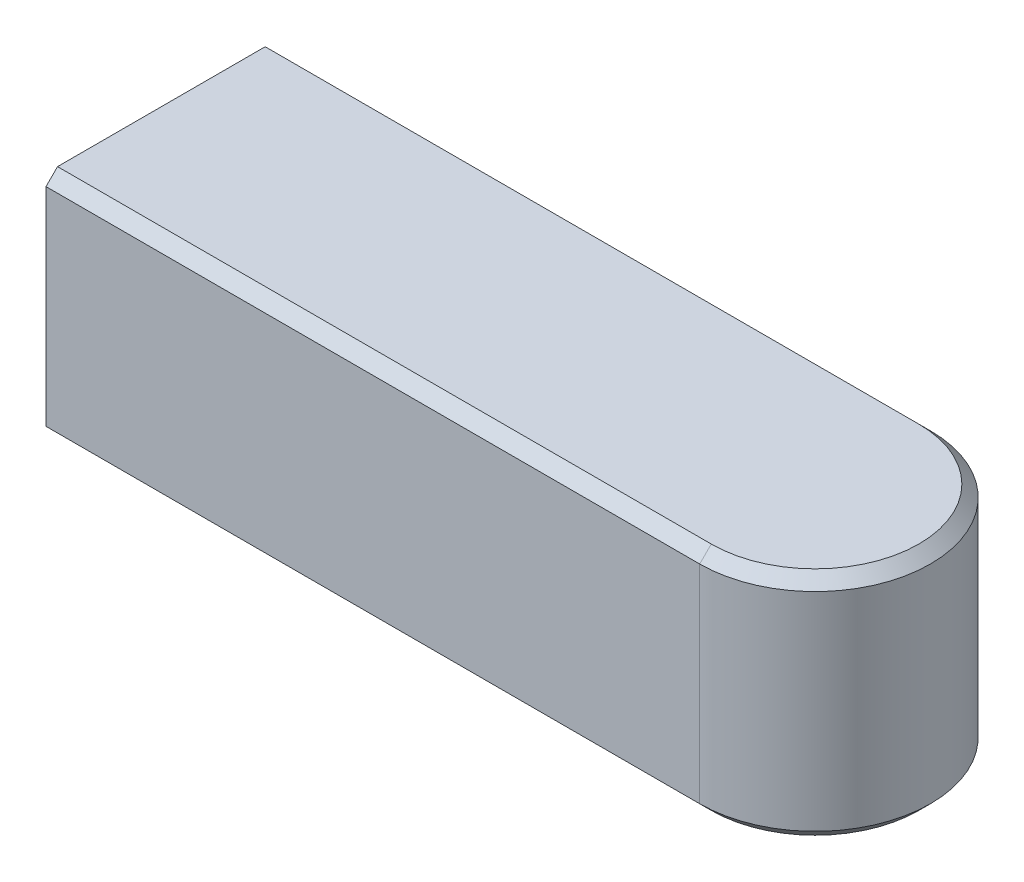
ISO-10303-21;
HEADER;
FILE_DESCRIPTION(('STEP AP214'),'2;1');
FILE_NAME('part.step','',(''),(''),'','','');
FILE_SCHEMA(('AUTOMOTIVE_DESIGN { 1 0 10303 214 1 1 1 1 }'));
ENDSEC;
DATA;
#1=APPLICATION_CONTEXT('core data for automotive mechanical design processes');
#2=APPLICATION_PROTOCOL_DEFINITION('international standard','automotive_design',2000,#1);
#3=PRODUCT_CONTEXT('',#1,'mechanical');
#4=PRODUCT('Part','Part','',(#3));
#5=PRODUCT_RELATED_PRODUCT_CATEGORY('part','',(#4));
#6=PRODUCT_DEFINITION_FORMATION('','',#4);
#7=PRODUCT_DEFINITION_CONTEXT('part definition',#1,'design');
#8=PRODUCT_DEFINITION('design','',#6,#7);
#9=PRODUCT_DEFINITION_SHAPE('','',#8);
#10=(LENGTH_UNIT() NAMED_UNIT(*) SI_UNIT(.MILLI.,.METRE.));
#11=(NAMED_UNIT(*) PLANE_ANGLE_UNIT() SI_UNIT($,.RADIAN.));
#12=(NAMED_UNIT(*) SI_UNIT($,.STERADIAN.) SOLID_ANGLE_UNIT());
#13=UNCERTAINTY_MEASURE_WITH_UNIT(LENGTH_MEASURE(1.E-05),#10,'distance_accuracy_value','');
#14=(GEOMETRIC_REPRESENTATION_CONTEXT(3) GLOBAL_UNCERTAINTY_ASSIGNED_CONTEXT((#13)) GLOBAL_UNIT_ASSIGNED_CONTEXT((#10,
#11,#12)) REPRESENTATION_CONTEXT('',''));
#15=CARTESIAN_POINT('',(0.,0.,0.));
#16=DIRECTION('',(0.,0.,1.));
#17=DIRECTION('',(1.,0.,0.));
#18=AXIS2_PLACEMENT_3D('',#15,#16,#17);
#19=CARTESIAN_POINT('',(7.,0.,0.));
#20=DIRECTION('',(0.,-1.,0.));
#21=DIRECTION('',(0.,0.,-1.));
#22=AXIS2_PLACEMENT_3D('',#19,#20,#21);
#23=CYLINDRICAL_SURFACE('',#22,3.);
#24=DIRECTION('',(0.,-1.,0.));
#25=VECTOR('',#24,1.);
#26=CARTESIAN_POINT('',(7.,6.,3.));
#27=LINE('',#26,#25);
#28=CARTESIAN_POINT('',(7.,0.299999999999996,3.));
#29=VERTEX_POINT('',#28);
#30=CARTESIAN_POINT('',(7.,5.7,3.));
#31=VERTEX_POINT('',#30);
#32=EDGE_CURVE('E123',#29,#31,#27,.F.);
#33=ORIENTED_EDGE('',*,*,#32,.F.);
#34=CARTESIAN_POINT('',(7.,0.299999999999996,0.));
#35=DIRECTION('',(0.,1.,0.));
#36=DIRECTION('',(0.,0.,1.));
#37=AXIS2_PLACEMENT_3D('',#34,#35,#36);
#38=CIRCLE('',#37,3.);
#39=CARTESIAN_POINT('',(7.,0.299999999999996,-3.));
#40=VERTEX_POINT('',#39);
#41=EDGE_CURVE('E122',#29,#40,#38,.T.);
#42=ORIENTED_EDGE('',*,*,#41,.T.);
#43=DIRECTION('',(0.,-1.,0.));
#44=VECTOR('',#43,1.);
#45=CARTESIAN_POINT('',(7.,6.,-3.));
#46=LINE('',#45,#44);
#47=CARTESIAN_POINT('',(7.,5.7,-3.));
#48=VERTEX_POINT('',#47);
#49=EDGE_CURVE('E108',#48,#40,#46,.T.);
#50=ORIENTED_EDGE('',*,*,#49,.F.);
#51=CARTESIAN_POINT('',(7.,5.7,0.));
#52=DIRECTION('',(0.,1.,0.));
#53=DIRECTION('',(0.,0.,1.));
#54=AXIS2_PLACEMENT_3D('',#51,#52,#53);
#55=CIRCLE('',#54,3.);
#56=EDGE_CURVE('E119',#48,#31,#55,.F.);
#57=ORIENTED_EDGE('',*,*,#56,.T.);
#58=EDGE_LOOP('',(#33,#42,#50,#57));
#59=FACE_BOUND('',#58,.T.);
#60=ADVANCED_FACE('F37',(#59),#23,.T.);
#61=CARTESIAN_POINT('',(-10.,6.,-3.));
#62=DIRECTION('',(1.,0.,0.));
#63=DIRECTION('',(0.,0.,-1.));
#64=AXIS2_PLACEMENT_3D('',#61,#62,#63);
#65=PLANE('',#64);
#66=DIRECTION('',(0.,-1.,0.));
#67=VECTOR('',#66,1.);
#68=CARTESIAN_POINT('',(-10.,6.,-3.));
#69=LINE('',#68,#67);
#70=CARTESIAN_POINT('',(-10.,5.7,-3.));
#71=VERTEX_POINT('',#70);
#72=CARTESIAN_POINT('',(-10.,0.299999999999996,-3.));
#73=VERTEX_POINT('',#72);
#74=EDGE_CURVE('E111',#71,#73,#69,.T.);
#75=ORIENTED_EDGE('',*,*,#74,.T.);
#76=DIRECTION('',(0.,0.707106781186543,-0.707106781186552));
#77=VECTOR('',#76,1.);
#78=CARTESIAN_POINT('',(-10.,0.299999999999996,-3.));
#79=LINE('',#78,#77);
#80=CARTESIAN_POINT('',(-10.,0.,-2.7));
#81=VERTEX_POINT('',#80);
#82=EDGE_CURVE('E153',#73,#81,#79,.F.);
#83=ORIENTED_EDGE('',*,*,#82,.T.);
#84=DIRECTION('',(0.,0.,1.));
#85=VECTOR('',#84,1.);
#86=CARTESIAN_POINT('',(-10.,0.,-3.));
#87=LINE('',#86,#85);
#88=CARTESIAN_POINT('',(-10.,0.,2.7));
#89=VERTEX_POINT('',#88);
#90=EDGE_CURVE('E138',#81,#89,#87,.T.);
#91=ORIENTED_EDGE('',*,*,#90,.T.);
#92=DIRECTION('',(0.,-0.707106781186543,-0.707106781186552));
#93=VECTOR('',#92,1.);
#94=CARTESIAN_POINT('',(-10.,0.299999999999996,3.));
#95=LINE('',#94,#93);
#96=CARTESIAN_POINT('',(-10.,0.299999999999996,3.));
#97=VERTEX_POINT('',#96);
#98=EDGE_CURVE('E155',#89,#97,#95,.F.);
#99=ORIENTED_EDGE('',*,*,#98,.T.);
#100=DIRECTION('',(0.,-1.,0.));
#101=VECTOR('',#100,1.);
#102=CARTESIAN_POINT('',(-10.,6.,3.));
#103=LINE('',#102,#101);
#104=CARTESIAN_POINT('',(-10.,5.7,3.));
#105=VERTEX_POINT('',#104);
#106=EDGE_CURVE('E163',#105,#97,#103,.T.);
#107=ORIENTED_EDGE('',*,*,#106,.F.);
#108=DIRECTION('',(0.,0.707106781186548,-0.707106781186548));
#109=VECTOR('',#108,1.);
#110=CARTESIAN_POINT('',(-10.,6.,2.7));
#111=LINE('',#110,#109);
#112=CARTESIAN_POINT('',(-10.,6.,2.7));
#113=VERTEX_POINT('',#112);
#114=EDGE_CURVE('E159',#105,#113,#111,.T.);
#115=ORIENTED_EDGE('',*,*,#114,.T.);
#116=DIRECTION('',(0.,0.,1.));
#117=VECTOR('',#116,1.);
#118=CARTESIAN_POINT('',(-10.,6.,-3.));
#119=LINE('',#118,#117);
#120=CARTESIAN_POINT('',(-10.,6.,-2.7));
#121=VERTEX_POINT('',#120);
#122=EDGE_CURVE('E167',#121,#113,#119,.T.);
#123=ORIENTED_EDGE('',*,*,#122,.F.);
#124=DIRECTION('',(0.,-0.707106781186548,-0.707106781186548));
#125=VECTOR('',#124,1.);
#126=CARTESIAN_POINT('',(-10.,6.,-2.7));
#127=LINE('',#126,#125);
#128=EDGE_CURVE('E157',#121,#71,#127,.T.);
#129=ORIENTED_EDGE('',*,*,#128,.T.);
#130=EDGE_LOOP('',(#75,#83,#91,#99,#107,#115,#123,#129));
#131=FACE_BOUND('',#130,.T.);
#132=ADVANCED_FACE('F180',(#131),#65,.F.);
#133=CARTESIAN_POINT('',(-10.,6.,3.));
#134=DIRECTION('',(0.,0.,-1.));
#135=DIRECTION('',(-1.,0.,0.));
#136=AXIS2_PLACEMENT_3D('',#133,#134,#135);
#137=PLANE('',#136);
#138=ORIENTED_EDGE('',*,*,#106,.T.);
#139=DIRECTION('',(1.,0.,0.));
#140=VECTOR('',#139,1.);
#141=CARTESIAN_POINT('',(-10.,0.299999999999996,3.));
#142=LINE('',#141,#140);
#143=EDGE_CURVE('E143',#97,#29,#142,.T.);
#144=ORIENTED_EDGE('',*,*,#143,.T.);
#145=ORIENTED_EDGE('',*,*,#32,.T.);
#146=DIRECTION('',(-1.,0.,0.));
#147=VECTOR('',#146,1.);
#148=CARTESIAN_POINT('',(-10.,5.7,3.));
#149=LINE('',#148,#147);
#150=EDGE_CURVE('E145',#31,#105,#149,.T.);
#151=ORIENTED_EDGE('',*,*,#150,.T.);
#152=EDGE_LOOP('',(#138,#144,#145,#151));
#153=FACE_BOUND('',#152,.T.);
#154=ADVANCED_FACE('F178',(#153),#137,.F.);
#155=CARTESIAN_POINT('',(-10.,6.,-3.));
#156=DIRECTION('',(0.,0.,1.));
#157=DIRECTION('',(1.,0.,0.));
#158=AXIS2_PLACEMENT_3D('',#155,#156,#157);
#159=PLANE('',#158);
#160=ORIENTED_EDGE('',*,*,#49,.T.);
#161=DIRECTION('',(-1.,0.,0.));
#162=VECTOR('',#161,1.);
#163=CARTESIAN_POINT('',(-10.,0.299999999999996,-3.));
#164=LINE('',#163,#162);
#165=EDGE_CURVE('E114',#40,#73,#164,.T.);
#166=ORIENTED_EDGE('',*,*,#165,.T.);
#167=ORIENTED_EDGE('',*,*,#74,.F.);
#168=DIRECTION('',(1.,0.,0.));
#169=VECTOR('',#168,1.);
#170=CARTESIAN_POINT('',(7.,5.7,-3.));
#171=LINE('',#170,#169);
#172=EDGE_CURVE('E104',#71,#48,#171,.T.);
#173=ORIENTED_EDGE('',*,*,#172,.T.);
#174=EDGE_LOOP('',(#160,#166,#167,#173));
#175=FACE_BOUND('',#174,.T.);
#176=ADVANCED_FACE('F106',(#175),#159,.F.);
#177=CARTESIAN_POINT('',(0.,6.,0.));
#178=DIRECTION('',(0.,1.,0.));
#179=DIRECTION('',(0.,0.,1.));
#180=AXIS2_PLACEMENT_3D('',#177,#178,#179);
#181=PLANE('',#180);
#182=CARTESIAN_POINT('',(7.,6.,0.));
#183=DIRECTION('',(0.,1.,0.));
#184=DIRECTION('',(0.,0.,1.));
#185=AXIS2_PLACEMENT_3D('',#182,#183,#184);
#186=CIRCLE('',#185,2.7);
#187=CARTESIAN_POINT('',(7.,6.,2.7));
#188=VERTEX_POINT('',#187);
#189=CARTESIAN_POINT('',(7.,6.,-2.7));
#190=VERTEX_POINT('',#189);
#191=EDGE_CURVE('E46',#188,#190,#186,.T.);
#192=ORIENTED_EDGE('',*,*,#191,.T.);
#193=DIRECTION('',(-1.,0.,0.));
#194=VECTOR('',#193,1.);
#195=CARTESIAN_POINT('',(-10.,6.,-2.7));
#196=LINE('',#195,#194);
#197=EDGE_CURVE('E11',#190,#121,#196,.T.);
#198=ORIENTED_EDGE('',*,*,#197,.T.);
#199=ORIENTED_EDGE('',*,*,#122,.T.);
#200=DIRECTION('',(1.,0.,0.));
#201=VECTOR('',#200,1.);
#202=CARTESIAN_POINT('',(7.,6.,2.7));
#203=LINE('',#202,#201);
#204=EDGE_CURVE('E57',#113,#188,#203,.T.);
#205=ORIENTED_EDGE('',*,*,#204,.T.);
#206=EDGE_LOOP('',(#192,#198,#199,#205));
#207=FACE_BOUND('',#206,.T.);
#208=ADVANCED_FACE('F171',(#207),#181,.T.);
#209=CARTESIAN_POINT('',(0.,0.,0.));
#210=DIRECTION('',(0.,1.,0.));
#211=DIRECTION('',(0.,0.,1.));
#212=AXIS2_PLACEMENT_3D('',#209,#210,#211);
#213=PLANE('',#212);
#214=ORIENTED_EDGE('',*,*,#90,.F.);
#215=DIRECTION('',(1.,0.,0.));
#216=VECTOR('',#215,1.);
#217=CARTESIAN_POINT('',(0.,0.,-2.7));
#218=LINE('',#217,#216);
#219=CARTESIAN_POINT('',(7.,0.,-2.7));
#220=VERTEX_POINT('',#219);
#221=EDGE_CURVE('E130',#81,#220,#218,.T.);
#222=ORIENTED_EDGE('',*,*,#221,.T.);
#223=CARTESIAN_POINT('',(7.,0.,0.));
#224=DIRECTION('',(0.,1.,0.));
#225=DIRECTION('',(0.,0.,1.));
#226=AXIS2_PLACEMENT_3D('',#223,#224,#225);
#227=CIRCLE('',#226,2.7);
#228=CARTESIAN_POINT('',(7.,0.,2.7));
#229=VERTEX_POINT('',#228);
#230=EDGE_CURVE('E149',#220,#229,#227,.F.);
#231=ORIENTED_EDGE('',*,*,#230,.T.);
#232=DIRECTION('',(-1.,0.,0.));
#233=VECTOR('',#232,1.);
#234=CARTESIAN_POINT('',(0.,0.,2.7));
#235=LINE('',#234,#233);
#236=EDGE_CURVE('E151',#229,#89,#235,.T.);
#237=ORIENTED_EDGE('',*,*,#236,.T.);
#238=EDGE_LOOP('',(#214,#222,#231,#237));
#239=FACE_BOUND('',#238,.T.);
#240=ADVANCED_FACE('F195',(#239),#213,.F.);
#241=CARTESIAN_POINT('',(-10.,0.299999999999996,3.));
#242=DIRECTION('',(0.,0.707106781186552,-0.707106781186543));
#243=DIRECTION('',(1.,0.,0.));
#244=AXIS2_PLACEMENT_3D('',#241,#242,#243);
#245=PLANE('',#244);
#246=ORIENTED_EDGE('',*,*,#98,.F.);
#247=ORIENTED_EDGE('',*,*,#236,.F.);
#248=DIRECTION('',(0.,-0.707106781186543,-0.707106781186552));
#249=VECTOR('',#248,1.);
#250=CARTESIAN_POINT('',(7.,0.299999999999996,3.));
#251=LINE('',#250,#249);
#252=EDGE_CURVE('E135',#29,#229,#251,.T.);
#253=ORIENTED_EDGE('',*,*,#252,.F.);
#254=ORIENTED_EDGE('',*,*,#143,.F.);
#255=EDGE_LOOP('',(#246,#247,#253,#254));
#256=FACE_BOUND('',#255,.T.);
#257=ADVANCED_FACE('F185',(#256),#245,.F.);
#258=CARTESIAN_POINT('',(7.,0.,0.));
#259=DIRECTION('',(0.,1.,0.));
#260=DIRECTION('',(0.,0.,1.));
#261=AXIS2_PLACEMENT_3D('',#258,#259,#260);
#262=CONICAL_SURFACE('',#261,2.7,0.785398163397454);
#263=ORIENTED_EDGE('',*,*,#252,.T.);
#264=ORIENTED_EDGE('',*,*,#230,.F.);
#265=DIRECTION('',(0.,-0.707106781186543,0.707106781186551));
#266=VECTOR('',#265,1.);
#267=CARTESIAN_POINT('',(7.,0.299999999999996,-3.));
#268=LINE('',#267,#266);
#269=EDGE_CURVE('E133',#40,#220,#268,.T.);
#270=ORIENTED_EDGE('',*,*,#269,.F.);
#271=ORIENTED_EDGE('',*,*,#41,.F.);
#272=EDGE_LOOP('',(#263,#264,#270,#271));
#273=FACE_BOUND('',#272,.T.);
#274=ADVANCED_FACE('F189',(#273),#262,.T.);
#275=CARTESIAN_POINT('',(-10.,0.299999999999996,-3.));
#276=DIRECTION('',(0.,0.707106781186552,0.707106781186543));
#277=DIRECTION('',(-1.,0.,0.));
#278=AXIS2_PLACEMENT_3D('',#275,#276,#277);
#279=PLANE('',#278);
#280=ORIENTED_EDGE('',*,*,#269,.T.);
#281=ORIENTED_EDGE('',*,*,#221,.F.);
#282=ORIENTED_EDGE('',*,*,#82,.F.);
#283=ORIENTED_EDGE('',*,*,#165,.F.);
#284=EDGE_LOOP('',(#280,#281,#282,#283));
#285=FACE_BOUND('',#284,.T.);
#286=ADVANCED_FACE('F193',(#285),#279,.F.);
#287=CARTESIAN_POINT('',(0.,6.,2.7));
#288=DIRECTION('',(0.,0.707106781186548,0.707106781186548));
#289=DIRECTION('',(-1.,0.,0.));
#290=AXIS2_PLACEMENT_3D('',#287,#288,#289);
#291=PLANE('',#290);
#292=ORIENTED_EDGE('',*,*,#114,.F.);
#293=ORIENTED_EDGE('',*,*,#150,.F.);
#294=DIRECTION('',(0.,-0.707106781186548,0.707106781186548));
#295=VECTOR('',#294,1.);
#296=CARTESIAN_POINT('',(7.,6.,2.7));
#297=LINE('',#296,#295);
#298=EDGE_CURVE('E41',#188,#31,#297,.T.);
#299=ORIENTED_EDGE('',*,*,#298,.F.);
#300=ORIENTED_EDGE('',*,*,#204,.F.);
#301=EDGE_LOOP('',(#292,#293,#299,#300));
#302=FACE_BOUND('',#301,.T.);
#303=ADVANCED_FACE('F39',(#302),#291,.T.);
#304=CARTESIAN_POINT('',(7.,6.,0.));
#305=DIRECTION('',(0.,-1.,0.));
#306=DIRECTION('',(0.,0.,-1.));
#307=AXIS2_PLACEMENT_3D('',#304,#305,#306);
#308=CONICAL_SURFACE('',#307,2.7,0.785398163397448);
#309=ORIENTED_EDGE('',*,*,#298,.T.);
#310=ORIENTED_EDGE('',*,*,#56,.F.);
#311=DIRECTION('',(0.,-0.707106781186548,-0.707106781186548));
#312=VECTOR('',#311,1.);
#313=CARTESIAN_POINT('',(7.,6.,-2.7));
#314=LINE('',#313,#312);
#315=EDGE_CURVE('E128',#190,#48,#314,.T.);
#316=ORIENTED_EDGE('',*,*,#315,.F.);
#317=ORIENTED_EDGE('',*,*,#191,.F.);
#318=EDGE_LOOP('',(#309,#310,#316,#317));
#319=FACE_BOUND('',#318,.T.);
#320=ADVANCED_FACE('F127',(#319),#308,.T.);
#321=CARTESIAN_POINT('',(0.,6.,-2.7));
#322=DIRECTION('',(0.,0.707106781186548,-0.707106781186548));
#323=DIRECTION('',(1.,0.,0.));
#324=AXIS2_PLACEMENT_3D('',#321,#322,#323);
#325=PLANE('',#324);
#326=ORIENTED_EDGE('',*,*,#315,.T.);
#327=ORIENTED_EDGE('',*,*,#172,.F.);
#328=ORIENTED_EDGE('',*,*,#128,.F.);
#329=ORIENTED_EDGE('',*,*,#197,.F.);
#330=EDGE_LOOP('',(#326,#327,#328,#329));
#331=FACE_BOUND('',#330,.T.);
#332=ADVANCED_FACE('F132',(#331),#325,.T.);
#333=CLOSED_SHELL('',(#60,#132,#154,#176,#208,#240,#257,#274,#286,#303,#320,#332));
#334=MANIFOLD_SOLID_BREP('B2',#333);
#335=ADVANCED_BREP_SHAPE_REPRESENTATION('',(#18,#334),#14);
#336=SHAPE_DEFINITION_REPRESENTATION(#9,#335);
ENDSEC;
END-ISO-10303-21;
